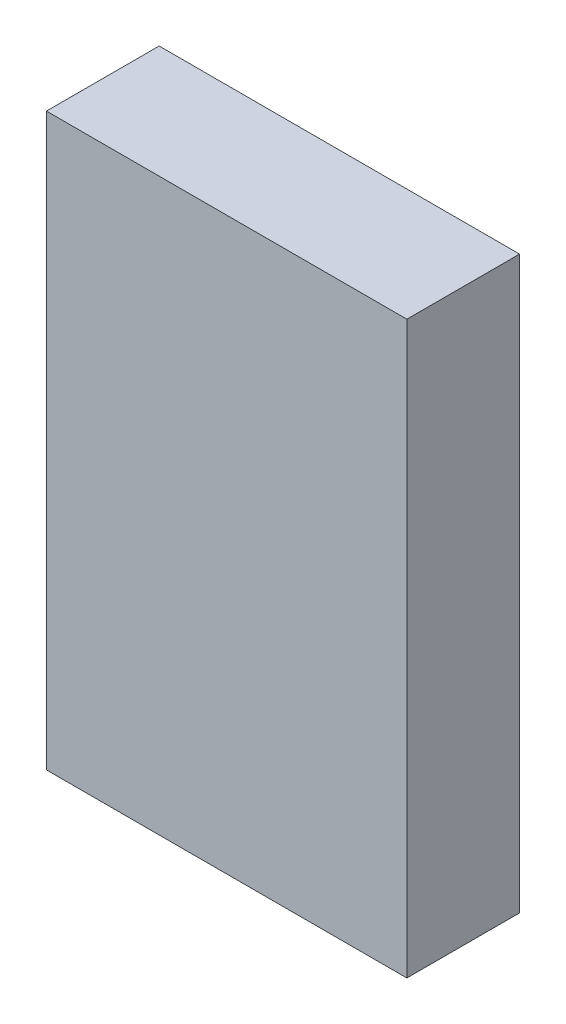
ISO-10303-21;
HEADER;
FILE_DESCRIPTION(('STEP AP214'),'2;1');
FILE_NAME('part.step','',(''),(''),'','','');
FILE_SCHEMA(('AUTOMOTIVE_DESIGN { 1 0 10303 214 1 1 1 1 }'));
ENDSEC;
DATA;
#1=APPLICATION_CONTEXT('core data for automotive mechanical design processes');
#2=APPLICATION_PROTOCOL_DEFINITION('international standard','automotive_design',2000,#1);
#3=PRODUCT_CONTEXT('',#1,'mechanical');
#4=PRODUCT('Part','Part','',(#3));
#5=PRODUCT_RELATED_PRODUCT_CATEGORY('part','',(#4));
#6=PRODUCT_DEFINITION_FORMATION('','',#4);
#7=PRODUCT_DEFINITION_CONTEXT('part definition',#1,'design');
#8=PRODUCT_DEFINITION('design','',#6,#7);
#9=PRODUCT_DEFINITION_SHAPE('','',#8);
#10=(LENGTH_UNIT() NAMED_UNIT(*) SI_UNIT(.MILLI.,.METRE.));
#11=(NAMED_UNIT(*) PLANE_ANGLE_UNIT() SI_UNIT($,.RADIAN.));
#12=(NAMED_UNIT(*) SI_UNIT($,.STERADIAN.) SOLID_ANGLE_UNIT());
#13=UNCERTAINTY_MEASURE_WITH_UNIT(LENGTH_MEASURE(1.E-05),#10,'distance_accuracy_value','');
#14=(GEOMETRIC_REPRESENTATION_CONTEXT(3) GLOBAL_UNCERTAINTY_ASSIGNED_CONTEXT((#13)) GLOBAL_UNIT_ASSIGNED_CONTEXT((#10,
#11,#12)) REPRESENTATION_CONTEXT('',''));
#15=CARTESIAN_POINT('',(0.,0.,0.));
#16=DIRECTION('',(0.,0.,1.));
#17=DIRECTION('',(1.,0.,0.));
#18=AXIS2_PLACEMENT_3D('',#15,#16,#17);
#19=CARTESIAN_POINT('',(-52.3875,-82.931,-32.766));
#20=DIRECTION('',(-1.,0.,0.));
#21=DIRECTION('',(0.,0.,1.));
#22=AXIS2_PLACEMENT_3D('',#19,#20,#21);
#23=PLANE('',#22);
#24=DIRECTION('',(0.,-1.,0.));
#25=VECTOR('',#24,1.);
#26=CARTESIAN_POINT('',(-52.3875,-82.931,0.));
#27=LINE('',#26,#25);
#28=CARTESIAN_POINT('',(-52.3875,82.931,0.));
#29=VERTEX_POINT('',#28);
#30=CARTESIAN_POINT('',(-52.3875,-82.931,0.));
#31=VERTEX_POINT('',#30);
#32=EDGE_CURVE('E165',#29,#31,#27,.T.);
#33=ORIENTED_EDGE('',*,*,#32,.F.);
#34=DIRECTION('',(0.,0.,1.));
#35=VECTOR('',#34,1.);
#36=CARTESIAN_POINT('',(-52.3875,82.931,-32.766));
#37=LINE('',#36,#35);
#38=CARTESIAN_POINT('',(-52.3875,82.931,-32.766));
#39=VERTEX_POINT('',#38);
#40=EDGE_CURVE('E11',#39,#29,#37,.T.);
#41=ORIENTED_EDGE('',*,*,#40,.F.);
#42=DIRECTION('',(0.,-1.,0.));
#43=VECTOR('',#42,1.);
#44=CARTESIAN_POINT('',(-52.3875,-82.931,-32.766));
#45=LINE('',#44,#43);
#46=CARTESIAN_POINT('',(-52.3875,-82.931,-32.766));
#47=VERTEX_POINT('',#46);
#48=EDGE_CURVE('E171',#39,#47,#45,.T.);
#49=ORIENTED_EDGE('',*,*,#48,.T.);
#50=DIRECTION('',(0.,0.,1.));
#51=VECTOR('',#50,1.);
#52=CARTESIAN_POINT('',(-52.3875,-82.931,-32.766));
#53=LINE('',#52,#51);
#54=EDGE_CURVE('E48',#47,#31,#53,.T.);
#55=ORIENTED_EDGE('',*,*,#54,.T.);
#56=EDGE_LOOP('',(#33,#41,#49,#55));
#57=FACE_BOUND('',#56,.T.);
#58=ADVANCED_FACE('F45',(#57),#23,.T.);
#59=CARTESIAN_POINT('',(52.3875,82.931,-32.766));
#60=DIRECTION('',(0.,1.,0.));
#61=DIRECTION('',(0.,0.,1.));
#62=AXIS2_PLACEMENT_3D('',#59,#60,#61);
#63=PLANE('',#62);
#64=DIRECTION('',(-1.,0.,0.));
#65=VECTOR('',#64,1.);
#66=CARTESIAN_POINT('',(52.3875,82.931,0.));
#67=LINE('',#66,#65);
#68=CARTESIAN_POINT('',(52.3875,82.931,0.));
#69=VERTEX_POINT('',#68);
#70=EDGE_CURVE('E175',#69,#29,#67,.T.);
#71=ORIENTED_EDGE('',*,*,#70,.F.);
#72=DIRECTION('',(0.,0.,1.));
#73=VECTOR('',#72,1.);
#74=CARTESIAN_POINT('',(52.3875,82.931,-32.766));
#75=LINE('',#74,#73);
#76=CARTESIAN_POINT('',(52.3875,82.931,-32.766));
#77=VERTEX_POINT('',#76);
#78=EDGE_CURVE('E54',#77,#69,#75,.T.);
#79=ORIENTED_EDGE('',*,*,#78,.F.);
#80=DIRECTION('',(-1.,0.,0.));
#81=VECTOR('',#80,1.);
#82=CARTESIAN_POINT('',(52.3875,82.931,-32.766));
#83=LINE('',#82,#81);
#84=EDGE_CURVE('E182',#77,#39,#83,.T.);
#85=ORIENTED_EDGE('',*,*,#84,.T.);
#86=ORIENTED_EDGE('',*,*,#40,.T.);
#87=EDGE_LOOP('',(#71,#79,#85,#86));
#88=FACE_BOUND('',#87,.T.);
#89=ADVANCED_FACE('F211',(#88),#63,.T.);
#90=CARTESIAN_POINT('',(52.3875,-82.931,-32.766));
#91=DIRECTION('',(1.,0.,0.));
#92=DIRECTION('',(0.,1.,0.));
#93=AXIS2_PLACEMENT_3D('',#90,#91,#92);
#94=PLANE('',#93);
#95=DIRECTION('',(0.,1.,0.));
#96=VECTOR('',#95,1.);
#97=CARTESIAN_POINT('',(52.3875,-82.931,0.));
#98=LINE('',#97,#96);
#99=CARTESIAN_POINT('',(52.3875,-82.931,0.));
#100=VERTEX_POINT('',#99);
#101=EDGE_CURVE('E192',#100,#69,#98,.T.);
#102=ORIENTED_EDGE('',*,*,#101,.F.);
#103=DIRECTION('',(0.,0.,1.));
#104=VECTOR('',#103,1.);
#105=CARTESIAN_POINT('',(52.3875,-82.931,-32.766));
#106=LINE('',#105,#104);
#107=CARTESIAN_POINT('',(52.3875,-82.931,-32.766));
#108=VERTEX_POINT('',#107);
#109=EDGE_CURVE('E200',#108,#100,#106,.T.);
#110=ORIENTED_EDGE('',*,*,#109,.F.);
#111=DIRECTION('',(0.,1.,0.));
#112=VECTOR('',#111,1.);
#113=CARTESIAN_POINT('',(52.3875,-82.931,-32.766));
#114=LINE('',#113,#112);
#115=EDGE_CURVE('E178',#108,#77,#114,.T.);
#116=ORIENTED_EDGE('',*,*,#115,.T.);
#117=ORIENTED_EDGE('',*,*,#78,.T.);
#118=EDGE_LOOP('',(#102,#110,#116,#117));
#119=FACE_BOUND('',#118,.T.);
#120=ADVANCED_FACE('F215',(#119),#94,.T.);
#121=CARTESIAN_POINT('',(52.3875,-82.931,-32.766));
#122=DIRECTION('',(0.,-1.,0.));
#123=DIRECTION('',(1.,0.,0.));
#124=AXIS2_PLACEMENT_3D('',#121,#122,#123);
#125=PLANE('',#124);
#126=DIRECTION('',(1.,0.,0.));
#127=VECTOR('',#126,1.);
#128=CARTESIAN_POINT('',(52.3875,-82.931,0.));
#129=LINE('',#128,#127);
#130=EDGE_CURVE('E188',#31,#100,#129,.T.);
#131=ORIENTED_EDGE('',*,*,#130,.F.);
#132=ORIENTED_EDGE('',*,*,#54,.F.);
#133=DIRECTION('',(1.,0.,0.));
#134=VECTOR('',#133,1.);
#135=CARTESIAN_POINT('',(52.3875,-82.931,-32.766));
#136=LINE('',#135,#134);
#137=EDGE_CURVE('E174',#47,#108,#136,.T.);
#138=ORIENTED_EDGE('',*,*,#137,.T.);
#139=ORIENTED_EDGE('',*,*,#109,.T.);
#140=EDGE_LOOP('',(#131,#132,#138,#139));
#141=FACE_BOUND('',#140,.T.);
#142=ADVANCED_FACE('F208',(#141),#125,.T.);
#143=CARTESIAN_POINT('',(0.,0.,-32.766));
#144=DIRECTION('',(0.,0.,1.));
#145=DIRECTION('',(1.,0.,0.));
#146=AXIS2_PLACEMENT_3D('',#143,#144,#145);
#147=PLANE('',#146);
#148=DIRECTION('',(-1.,0.,0.));
#149=VECTOR('',#148,1.);
#150=CARTESIAN_POINT('',(-50.8,-60.325,-32.766));
#151=LINE('',#150,#149);
#152=CARTESIAN_POINT('',(50.8,-60.325,-32.766));
#153=VERTEX_POINT('',#152);
#154=CARTESIAN_POINT('',(-50.8,-60.325,-32.766));
#155=VERTEX_POINT('',#154);
#156=EDGE_CURVE('E156',#153,#155,#151,.T.);
#157=ORIENTED_EDGE('',*,*,#156,.F.);
#158=DIRECTION('',(0.,-1.,0.));
#159=VECTOR('',#158,1.);
#160=CARTESIAN_POINT('',(50.8,-60.325,-32.766));
#161=LINE('',#160,#159);
#162=CARTESIAN_POINT('',(50.8,60.325,-32.766));
#163=VERTEX_POINT('',#162);
#164=EDGE_CURVE('E62',#163,#153,#161,.T.);
#165=ORIENTED_EDGE('',*,*,#164,.F.);
#166=DIRECTION('',(1.,0.,0.));
#167=VECTOR('',#166,1.);
#168=CARTESIAN_POINT('',(-50.8,60.325,-32.766));
#169=LINE('',#168,#167);
#170=CARTESIAN_POINT('',(-50.8,60.325,-32.766));
#171=VERTEX_POINT('',#170);
#172=EDGE_CURVE('E141',#171,#163,#169,.T.);
#173=ORIENTED_EDGE('',*,*,#172,.F.);
#174=DIRECTION('',(0.,1.,0.));
#175=VECTOR('',#174,1.);
#176=CARTESIAN_POINT('',(-50.8,-60.325,-32.766));
#177=LINE('',#176,#175);
#178=EDGE_CURVE('E147',#155,#171,#177,.T.);
#179=ORIENTED_EDGE('',*,*,#178,.F.);
#180=EDGE_LOOP('',(#157,#165,#173,#179));
#181=FACE_BOUND('',#180,.T.);
#182=ORIENTED_EDGE('',*,*,#48,.F.);
#183=ORIENTED_EDGE('',*,*,#84,.F.);
#184=ORIENTED_EDGE('',*,*,#115,.F.);
#185=ORIENTED_EDGE('',*,*,#137,.F.);
#186=EDGE_LOOP('',(#182,#183,#184,#185));
#187=FACE_BOUND('',#186,.T.);
#188=ADVANCED_FACE('F217',(#181,#187),#147,.F.);
#189=CARTESIAN_POINT('',(0.,0.,0.));
#190=DIRECTION('',(0.,0.,1.));
#191=DIRECTION('',(1.,0.,0.));
#192=AXIS2_PLACEMENT_3D('',#189,#190,#191);
#193=PLANE('',#192);
#194=ORIENTED_EDGE('',*,*,#32,.T.);
#195=ORIENTED_EDGE('',*,*,#130,.T.);
#196=ORIENTED_EDGE('',*,*,#101,.T.);
#197=ORIENTED_EDGE('',*,*,#70,.T.);
#198=EDGE_LOOP('',(#194,#195,#196,#197));
#199=FACE_BOUND('',#198,.T.);
#200=ADVANCED_FACE('F210',(#199),#193,.T.);
#201=CARTESIAN_POINT('',(50.8,-60.325,-7.36599999999999));
#202=DIRECTION('',(1.,0.,0.));
#203=DIRECTION('',(0.,0.,-1.));
#204=AXIS2_PLACEMENT_3D('',#201,#202,#203);
#205=PLANE('',#204);
#206=ORIENTED_EDGE('',*,*,#164,.T.);
#207=DIRECTION('',(0.,0.,-1.));
#208=VECTOR('',#207,1.);
#209=CARTESIAN_POINT('',(50.8,-60.325,-7.36599999999999));
#210=LINE('',#209,#208);
#211=CARTESIAN_POINT('',(50.8,-60.325,-7.36599999999999));
#212=VERTEX_POINT('',#211);
#213=EDGE_CURVE('E116',#212,#153,#210,.T.);
#214=ORIENTED_EDGE('',*,*,#213,.F.);
#215=DIRECTION('',(0.,-1.,0.));
#216=VECTOR('',#215,1.);
#217=CARTESIAN_POINT('',(50.8,-60.325,-7.36599999999999));
#218=LINE('',#217,#216);
#219=CARTESIAN_POINT('',(50.8,60.325,-7.36599999999999));
#220=VERTEX_POINT('',#219);
#221=EDGE_CURVE('E120',#220,#212,#218,.T.);
#222=ORIENTED_EDGE('',*,*,#221,.F.);
#223=DIRECTION('',(0.,0.,-1.));
#224=VECTOR('',#223,1.);
#225=CARTESIAN_POINT('',(50.8,60.325,-7.36599999999999));
#226=LINE('',#225,#224);
#227=EDGE_CURVE('E162',#220,#163,#226,.T.);
#228=ORIENTED_EDGE('',*,*,#227,.T.);
#229=EDGE_LOOP('',(#206,#214,#222,#228));
#230=FACE_BOUND('',#229,.T.);
#231=ADVANCED_FACE('F118',(#230),#205,.F.);
#232=CARTESIAN_POINT('',(-50.8,60.325,-7.36599999999999));
#233=DIRECTION('',(0.,1.,0.));
#234=DIRECTION('',(-1.,0.,0.));
#235=AXIS2_PLACEMENT_3D('',#232,#233,#234);
#236=PLANE('',#235);
#237=ORIENTED_EDGE('',*,*,#172,.T.);
#238=ORIENTED_EDGE('',*,*,#227,.F.);
#239=DIRECTION('',(1.,0.,0.));
#240=VECTOR('',#239,1.);
#241=CARTESIAN_POINT('',(-50.8,60.325,-7.36599999999999));
#242=LINE('',#241,#240);
#243=CARTESIAN_POINT('',(-50.8,60.325,-7.36599999999999));
#244=VERTEX_POINT('',#243);
#245=EDGE_CURVE('E127',#244,#220,#242,.T.);
#246=ORIENTED_EDGE('',*,*,#245,.F.);
#247=DIRECTION('',(0.,0.,-1.));
#248=VECTOR('',#247,1.);
#249=CARTESIAN_POINT('',(-50.8,60.325,-7.36599999999999));
#250=LINE('',#249,#248);
#251=EDGE_CURVE('E166',#244,#171,#250,.T.);
#252=ORIENTED_EDGE('',*,*,#251,.T.);
#253=EDGE_LOOP('',(#237,#238,#246,#252));
#254=FACE_BOUND('',#253,.T.);
#255=ADVANCED_FACE('F264',(#254),#236,.F.);
#256=CARTESIAN_POINT('',(-50.8,-60.325,-7.36599999999999));
#257=DIRECTION('',(-1.,0.,0.));
#258=DIRECTION('',(0.,0.,1.));
#259=AXIS2_PLACEMENT_3D('',#256,#257,#258);
#260=PLANE('',#259);
#261=ORIENTED_EDGE('',*,*,#178,.T.);
#262=ORIENTED_EDGE('',*,*,#251,.F.);
#263=DIRECTION('',(0.,1.,0.));
#264=VECTOR('',#263,1.);
#265=CARTESIAN_POINT('',(-50.8,-60.325,-7.36599999999999));
#266=LINE('',#265,#264);
#267=CARTESIAN_POINT('',(-50.8,-60.325,-7.36599999999999));
#268=VERTEX_POINT('',#267);
#269=EDGE_CURVE('E136',#268,#244,#266,.T.);
#270=ORIENTED_EDGE('',*,*,#269,.F.);
#271=DIRECTION('',(0.,0.,-1.));
#272=VECTOR('',#271,1.);
#273=CARTESIAN_POINT('',(-50.8,-60.325,-7.36599999999999));
#274=LINE('',#273,#272);
#275=EDGE_CURVE('E126',#268,#155,#274,.T.);
#276=ORIENTED_EDGE('',*,*,#275,.T.);
#277=EDGE_LOOP('',(#261,#262,#270,#276));
#278=FACE_BOUND('',#277,.T.);
#279=ADVANCED_FACE('F273',(#278),#260,.F.);
#280=CARTESIAN_POINT('',(-50.8,-60.325,-7.36599999999999));
#281=DIRECTION('',(0.,-1.,0.));
#282=DIRECTION('',(1.,0.,0.));
#283=AXIS2_PLACEMENT_3D('',#280,#281,#282);
#284=PLANE('',#283);
#285=ORIENTED_EDGE('',*,*,#156,.T.);
#286=ORIENTED_EDGE('',*,*,#275,.F.);
#287=DIRECTION('',(-1.,0.,0.));
#288=VECTOR('',#287,1.);
#289=CARTESIAN_POINT('',(-50.8,-60.325,-7.36599999999999));
#290=LINE('',#289,#288);
#291=EDGE_CURVE('E130',#212,#268,#290,.T.);
#292=ORIENTED_EDGE('',*,*,#291,.F.);
#293=ORIENTED_EDGE('',*,*,#213,.T.);
#294=EDGE_LOOP('',(#285,#286,#292,#293));
#295=FACE_BOUND('',#294,.T.);
#296=ADVANCED_FACE('F131',(#295),#284,.F.);
#297=CARTESIAN_POINT('',(0.,0.,-7.36599999999999));
#298=DIRECTION('',(0.,0.,-1.));
#299=DIRECTION('',(-1.,0.,0.));
#300=AXIS2_PLACEMENT_3D('',#297,#298,#299);
#301=PLANE('',#300);
#302=ORIENTED_EDGE('',*,*,#221,.T.);
#303=ORIENTED_EDGE('',*,*,#291,.T.);
#304=ORIENTED_EDGE('',*,*,#269,.T.);
#305=ORIENTED_EDGE('',*,*,#245,.T.);
#306=EDGE_LOOP('',(#302,#303,#304,#305));
#307=FACE_BOUND('',#306,.T.);
#308=ADVANCED_FACE('F138',(#307),#301,.T.);
#309=CLOSED_SHELL('',(#58,#89,#120,#142,#188,#200,#231,#255,#279,#296,#308));
#310=MANIFOLD_SOLID_BREP('B2',#309);
#311=ADVANCED_BREP_SHAPE_REPRESENTATION('',(#18,#310),#14);
#312=SHAPE_DEFINITION_REPRESENTATION(#9,#311);
ENDSEC;
END-ISO-10303-21;
